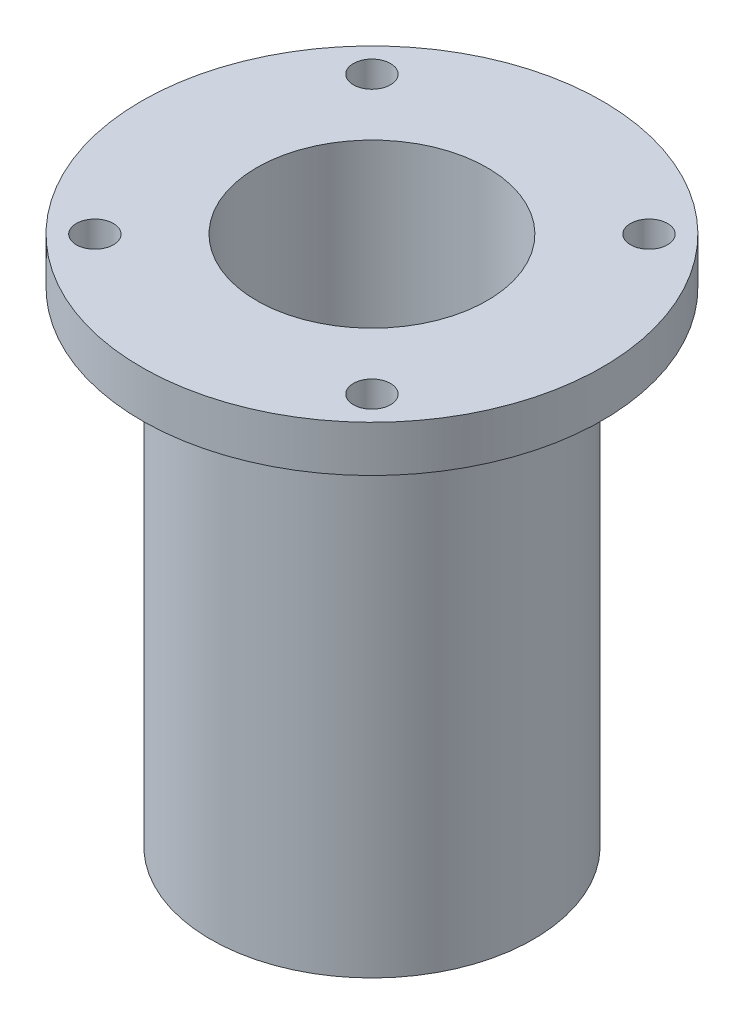
ISO-10303-21;
HEADER;
FILE_DESCRIPTION(('STEP AP214'),'2;1');
FILE_NAME('part.step','',(''),(''),'','','');
FILE_SCHEMA(('AUTOMOTIVE_DESIGN { 1 0 10303 214 1 1 1 1 }'));
ENDSEC;
DATA;
#1=APPLICATION_CONTEXT('core data for automotive mechanical design processes');
#2=APPLICATION_PROTOCOL_DEFINITION('international standard','automotive_design',2000,#1);
#3=PRODUCT_CONTEXT('',#1,'mechanical');
#4=PRODUCT('Part','Part','',(#3));
#5=PRODUCT_RELATED_PRODUCT_CATEGORY('part','',(#4));
#6=PRODUCT_DEFINITION_FORMATION('','',#4);
#7=PRODUCT_DEFINITION_CONTEXT('part definition',#1,'design');
#8=PRODUCT_DEFINITION('design','',#6,#7);
#9=PRODUCT_DEFINITION_SHAPE('','',#8);
#10=(LENGTH_UNIT() NAMED_UNIT(*) SI_UNIT(.MILLI.,.METRE.));
#11=(NAMED_UNIT(*) PLANE_ANGLE_UNIT() SI_UNIT($,.RADIAN.));
#12=(NAMED_UNIT(*) SI_UNIT($,.STERADIAN.) SOLID_ANGLE_UNIT());
#13=UNCERTAINTY_MEASURE_WITH_UNIT(LENGTH_MEASURE(1.E-05),#10,'distance_accuracy_value','');
#14=(GEOMETRIC_REPRESENTATION_CONTEXT(3) GLOBAL_UNCERTAINTY_ASSIGNED_CONTEXT((#13)) GLOBAL_UNIT_ASSIGNED_CONTEXT((#10,
#11,#12)) REPRESENTATION_CONTEXT('',''));
#15=CARTESIAN_POINT('',(0.,0.,0.));
#16=DIRECTION('',(0.,0.,1.));
#17=DIRECTION('',(1.,0.,0.));
#18=AXIS2_PLACEMENT_3D('',#15,#16,#17);
#19=CARTESIAN_POINT('',(0.,0.,0.));
#20=DIRECTION('',(0.,1.,0.));
#21=DIRECTION('',(-1.,0.,0.));
#22=AXIS2_PLACEMENT_3D('',#19,#20,#21);
#23=CYLINDRICAL_SURFACE('',#22,31.75);
#24=CARTESIAN_POINT('',(0.,-6.34999999999999,0.));
#25=DIRECTION('',(0.,1.,0.));
#26=DIRECTION('',(-1.,0.,0.));
#27=AXIS2_PLACEMENT_3D('',#24,#25,#26);
#28=CIRCLE('',#27,31.75);
#29=CARTESIAN_POINT('',(-31.75,-6.35,0.));
#30=VERTEX_POINT('',#29);
#31=EDGE_CURVE('E85',#30,#30,#28,.T.);
#32=ORIENTED_EDGE('',*,*,#31,.T.);
#33=EDGE_LOOP('',(#32));
#34=FACE_BOUND('',#33,.T.);
#35=CARTESIAN_POINT('',(0.,0.,0.));
#36=DIRECTION('',(0.,1.,0.));
#37=DIRECTION('',(-1.,0.,0.));
#38=AXIS2_PLACEMENT_3D('',#35,#36,#37);
#39=CIRCLE('',#38,31.75);
#40=CARTESIAN_POINT('',(-31.75,0.,0.));
#41=VERTEX_POINT('',#40);
#42=EDGE_CURVE('E10',#41,#41,#39,.T.);
#43=ORIENTED_EDGE('',*,*,#42,.F.);
#44=EDGE_LOOP('',(#43));
#45=FACE_BOUND('',#44,.T.);
#46=ADVANCED_FACE('F39',(#34,#45),#23,.T.);
#47=CARTESIAN_POINT('',(-31.75,0.,0.));
#48=DIRECTION('',(0.,1.,0.));
#49=DIRECTION('',(-1.,0.,0.));
#50=AXIS2_PLACEMENT_3D('',#47,#48,#49);
#51=PLANE('',#50);
#52=CARTESIAN_POINT('',(19.0830442572721,0.,19.0830442572718));
#53=DIRECTION('',(0.,1.,0.));
#54=DIRECTION('',(0.,0.,1.));
#55=AXIS2_PLACEMENT_3D('',#52,#53,#54);
#56=CIRCLE('',#55,2.5527);
#57=CARTESIAN_POINT('',(19.0830442572721,0.,21.6357442572718));
#58=VERTEX_POINT('',#57);
#59=EDGE_CURVE('E71',#58,#58,#56,.T.);
#60=ORIENTED_EDGE('',*,*,#59,.F.);
#61=EDGE_LOOP('',(#60));
#62=FACE_BOUND('',#61,.T.);
#63=CARTESIAN_POINT('',(-19.083044257272,0.,19.0830442572719));
#64=DIRECTION('',(0.,1.,0.));
#65=DIRECTION('',(0.,0.,1.));
#66=AXIS2_PLACEMENT_3D('',#63,#64,#65);
#67=CIRCLE('',#66,2.5527);
#68=CARTESIAN_POINT('',(-19.083044257272,0.,21.6357442572719));
#69=VERTEX_POINT('',#68);
#70=EDGE_CURVE('E61',#69,#69,#67,.T.);
#71=ORIENTED_EDGE('',*,*,#70,.F.);
#72=EDGE_LOOP('',(#71));
#73=FACE_BOUND('',#72,.T.);
#74=CARTESIAN_POINT('',(-19.0830442572719,0.,-19.083044257272));
#75=DIRECTION('',(0.,1.,0.));
#76=DIRECTION('',(0.,0.,1.));
#77=AXIS2_PLACEMENT_3D('',#74,#75,#76);
#78=CIRCLE('',#77,2.5527);
#79=CARTESIAN_POINT('',(-19.0830442572719,0.,-16.530344257272));
#80=VERTEX_POINT('',#79);
#81=EDGE_CURVE('E58',#80,#80,#78,.T.);
#82=ORIENTED_EDGE('',*,*,#81,.F.);
#83=EDGE_LOOP('',(#82));
#84=FACE_BOUND('',#83,.T.);
#85=CARTESIAN_POINT('',(19.083044257272,0.,-19.0830442572719));
#86=DIRECTION('',(0.,1.,0.));
#87=DIRECTION('',(0.,0.,1.));
#88=AXIS2_PLACEMENT_3D('',#85,#86,#87);
#89=CIRCLE('',#88,2.5527);
#90=CARTESIAN_POINT('',(19.083044257272,0.,-16.5303442572719));
#91=VERTEX_POINT('',#90);
#92=EDGE_CURVE('E57',#91,#91,#89,.T.);
#93=ORIENTED_EDGE('',*,*,#92,.F.);
#94=EDGE_LOOP('',(#93));
#95=FACE_BOUND('',#94,.T.);
#96=ORIENTED_EDGE('',*,*,#42,.T.);
#97=EDGE_LOOP('',(#96));
#98=FACE_BOUND('',#97,.T.);
#99=CARTESIAN_POINT('',(0.,0.,0.));
#100=DIRECTION('',(0.,1.,0.));
#101=DIRECTION('',(-1.,0.,0.));
#102=AXIS2_PLACEMENT_3D('',#99,#100,#101);
#103=CIRCLE('',#102,15.875);
#104=CARTESIAN_POINT('',(-15.875,0.,0.));
#105=VERTEX_POINT('',#104);
#106=EDGE_CURVE('E46',#105,#105,#103,.T.);
#107=ORIENTED_EDGE('',*,*,#106,.F.);
#108=EDGE_LOOP('',(#107));
#109=FACE_BOUND('',#108,.T.);
#110=ADVANCED_FACE('F100',(#62,#73,#84,#95,#98,#109),#51,.T.);
#111=CARTESIAN_POINT('',(0.,0.,0.));
#112=DIRECTION('',(0.,1.,0.));
#113=DIRECTION('',(-1.,0.,0.));
#114=AXIS2_PLACEMENT_3D('',#111,#112,#113);
#115=CYLINDRICAL_SURFACE('',#114,15.875);
#116=ORIENTED_EDGE('',*,*,#106,.T.);
#117=EDGE_LOOP('',(#116));
#118=FACE_BOUND('',#117,.T.);
#119=CARTESIAN_POINT('',(0.,-63.5,0.));
#120=DIRECTION('',(0.,1.,0.));
#121=DIRECTION('',(-1.,0.,0.));
#122=AXIS2_PLACEMENT_3D('',#119,#120,#121);
#123=CIRCLE('',#122,15.875);
#124=CARTESIAN_POINT('',(-15.875,-63.5,0.));
#125=VERTEX_POINT('',#124);
#126=EDGE_CURVE('E51',#125,#125,#123,.T.);
#127=ORIENTED_EDGE('',*,*,#126,.F.);
#128=EDGE_LOOP('',(#127));
#129=FACE_BOUND('',#128,.T.);
#130=ADVANCED_FACE('F98',(#118,#129),#115,.F.);
#131=CARTESIAN_POINT('',(-15.875,-63.5,0.));
#132=DIRECTION('',(0.,1.,0.));
#133=DIRECTION('',(-1.,0.,0.));
#134=AXIS2_PLACEMENT_3D('',#131,#132,#133);
#135=PLANE('',#134);
#136=CARTESIAN_POINT('',(0.,-63.5,0.));
#137=DIRECTION('',(0.,1.,0.));
#138=DIRECTION('',(-1.,0.,0.));
#139=AXIS2_PLACEMENT_3D('',#136,#137,#138);
#140=CIRCLE('',#139,7.13739999999999);
#141=CARTESIAN_POINT('',(-7.13739999999998,-63.5,0.));
#142=VERTEX_POINT('',#141);
#143=EDGE_CURVE('E82',#142,#142,#140,.T.);
#144=ORIENTED_EDGE('',*,*,#143,.F.);
#145=EDGE_LOOP('',(#144));
#146=FACE_BOUND('',#145,.T.);
#147=ORIENTED_EDGE('',*,*,#126,.T.);
#148=EDGE_LOOP('',(#147));
#149=FACE_BOUND('',#148,.T.);
#150=ADVANCED_FACE('F96',(#146,#149),#135,.T.);
#151=CARTESIAN_POINT('',(0.,-73.025,0.));
#152=DIRECTION('',(0.,-1.,0.));
#153=DIRECTION('',(1.,0.,0.));
#154=AXIS2_PLACEMENT_3D('',#151,#152,#153);
#155=PLANE('',#154);
#156=CARTESIAN_POINT('',(0.,-73.025,0.));
#157=DIRECTION('',(0.,-1.,0.));
#158=DIRECTION('',(0.,0.,-1.));
#159=AXIS2_PLACEMENT_3D('',#156,#157,#158);
#160=CIRCLE('',#159,7.13739999999999);
#161=CARTESIAN_POINT('',(0.,-73.025,-7.13739999999999));
#162=VERTEX_POINT('',#161);
#163=EDGE_CURVE('E79',#162,#162,#160,.T.);
#164=ORIENTED_EDGE('',*,*,#163,.F.);
#165=EDGE_LOOP('',(#164));
#166=FACE_BOUND('',#165,.T.);
#167=CARTESIAN_POINT('',(0.,-73.025,0.));
#168=DIRECTION('',(0.,1.,0.));
#169=DIRECTION('',(-1.,0.,0.));
#170=AXIS2_PLACEMENT_3D('',#167,#168,#169);
#171=CIRCLE('',#170,22.225);
#172=CARTESIAN_POINT('',(-22.225,-73.025,0.));
#173=VERTEX_POINT('',#172);
#174=EDGE_CURVE('E91',#173,#173,#171,.T.);
#175=ORIENTED_EDGE('',*,*,#174,.F.);
#176=EDGE_LOOP('',(#175));
#177=FACE_BOUND('',#176,.T.);
#178=ADVANCED_FACE('F108',(#166,#177),#155,.T.);
#179=CARTESIAN_POINT('',(0.,0.,0.));
#180=DIRECTION('',(0.,1.,0.));
#181=DIRECTION('',(-1.,0.,0.));
#182=AXIS2_PLACEMENT_3D('',#179,#180,#181);
#183=CYLINDRICAL_SURFACE('',#182,22.225);
#184=ORIENTED_EDGE('',*,*,#174,.T.);
#185=EDGE_LOOP('',(#184));
#186=FACE_BOUND('',#185,.T.);
#187=CARTESIAN_POINT('',(0.,-6.34999999999999,0.));
#188=DIRECTION('',(0.,1.,0.));
#189=DIRECTION('',(-1.,0.,0.));
#190=AXIS2_PLACEMENT_3D('',#187,#188,#189);
#191=CIRCLE('',#190,22.225);
#192=CARTESIAN_POINT('',(-22.225,-6.34999999999999,0.));
#193=VERTEX_POINT('',#192);
#194=EDGE_CURVE('E88',#193,#193,#191,.T.);
#195=ORIENTED_EDGE('',*,*,#194,.F.);
#196=EDGE_LOOP('',(#195));
#197=FACE_BOUND('',#196,.T.);
#198=ADVANCED_FACE('F122',(#186,#197),#183,.T.);
#199=CARTESIAN_POINT('',(-22.225,-6.34999999999999,0.));
#200=DIRECTION('',(0.,-1.,0.));
#201=DIRECTION('',(1.,0.,0.));
#202=AXIS2_PLACEMENT_3D('',#199,#200,#201);
#203=PLANE('',#202);
#204=CARTESIAN_POINT('',(19.0830442572721,-6.34999999999999,19.0830442572718));
#205=DIRECTION('',(0.,-1.,0.));
#206=DIRECTION('',(1.,0.,0.));
#207=AXIS2_PLACEMENT_3D('',#204,#205,#206);
#208=CIRCLE('',#207,2.5527);
#209=CARTESIAN_POINT('',(21.6357442572721,-6.34999999999999,19.0830442572718));
#210=VERTEX_POINT('',#209);
#211=EDGE_CURVE('E42',#210,#210,#208,.T.);
#212=ORIENTED_EDGE('',*,*,#211,.F.);
#213=EDGE_LOOP('',(#212));
#214=FACE_BOUND('',#213,.T.);
#215=CARTESIAN_POINT('',(-19.083044257272,-6.34999999999999,19.0830442572719));
#216=DIRECTION('',(0.,-1.,0.));
#217=DIRECTION('',(1.,0.,0.));
#218=AXIS2_PLACEMENT_3D('',#215,#216,#217);
#219=CIRCLE('',#218,2.5527);
#220=CARTESIAN_POINT('',(-16.5303442572721,-6.34999999999999,19.0830442572719));
#221=VERTEX_POINT('',#220);
#222=EDGE_CURVE('E59',#221,#221,#219,.T.);
#223=ORIENTED_EDGE('',*,*,#222,.F.);
#224=EDGE_LOOP('',(#223));
#225=FACE_BOUND('',#224,.T.);
#226=CARTESIAN_POINT('',(-19.0830442572719,-6.34999999999999,-19.083044257272));
#227=DIRECTION('',(0.,-1.,0.));
#228=DIRECTION('',(1.,0.,0.));
#229=AXIS2_PLACEMENT_3D('',#226,#227,#228);
#230=CIRCLE('',#229,2.5527);
#231=CARTESIAN_POINT('',(-16.5303442572719,-6.34999999999999,-19.083044257272));
#232=VERTEX_POINT('',#231);
#233=EDGE_CURVE('E55',#232,#232,#230,.T.);
#234=ORIENTED_EDGE('',*,*,#233,.F.);
#235=EDGE_LOOP('',(#234));
#236=FACE_BOUND('',#235,.T.);
#237=CARTESIAN_POINT('',(19.083044257272,-6.34999999999999,-19.0830442572719));
#238=DIRECTION('',(0.,-1.,0.));
#239=DIRECTION('',(1.,0.,0.));
#240=AXIS2_PLACEMENT_3D('',#237,#238,#239);
#241=CIRCLE('',#240,2.5527);
#242=CARTESIAN_POINT('',(21.635744257272,-6.34999999999999,-19.0830442572719));
#243=VERTEX_POINT('',#242);
#244=EDGE_CURVE('E76',#243,#243,#241,.T.);
#245=ORIENTED_EDGE('',*,*,#244,.F.);
#246=EDGE_LOOP('',(#245));
#247=FACE_BOUND('',#246,.T.);
#248=ORIENTED_EDGE('',*,*,#194,.T.);
#249=EDGE_LOOP('',(#248));
#250=FACE_BOUND('',#249,.T.);
#251=ORIENTED_EDGE('',*,*,#31,.F.);
#252=EDGE_LOOP('',(#251));
#253=FACE_BOUND('',#252,.T.);
#254=ADVANCED_FACE('F119',(#214,#225,#236,#247,#250,#253),#203,.T.);
#255=CARTESIAN_POINT('',(0.,-73.025,0.));
#256=DIRECTION('',(0.,-1.,0.));
#257=DIRECTION('',(0.,0.,-1.));
#258=AXIS2_PLACEMENT_3D('',#255,#256,#257);
#259=CYLINDRICAL_SURFACE('',#258,7.13739999999999);
#260=ORIENTED_EDGE('',*,*,#143,.T.);
#261=EDGE_LOOP('',(#260));
#262=FACE_BOUND('',#261,.T.);
#263=ORIENTED_EDGE('',*,*,#163,.T.);
#264=EDGE_LOOP('',(#263));
#265=FACE_BOUND('',#264,.T.);
#266=ADVANCED_FACE('F121',(#262,#265),#259,.F.);
#267=CARTESIAN_POINT('',(19.083044257272,0.,-19.0830442572719));
#268=DIRECTION('',(0.,1.,0.));
#269=DIRECTION('',(0.,0.,1.));
#270=AXIS2_PLACEMENT_3D('',#267,#268,#269);
#271=CYLINDRICAL_SURFACE('',#270,2.5527);
#272=ORIENTED_EDGE('',*,*,#244,.T.);
#273=EDGE_LOOP('',(#272));
#274=FACE_BOUND('',#273,.T.);
#275=ORIENTED_EDGE('',*,*,#92,.T.);
#276=EDGE_LOOP('',(#275));
#277=FACE_BOUND('',#276,.T.);
#278=ADVANCED_FACE('F129',(#274,#277),#271,.F.);
#279=CARTESIAN_POINT('',(-19.0830442572719,0.,-19.083044257272));
#280=DIRECTION('',(0.,1.,0.));
#281=DIRECTION('',(0.,0.,1.));
#282=AXIS2_PLACEMENT_3D('',#279,#280,#281);
#283=CYLINDRICAL_SURFACE('',#282,2.5527);
#284=ORIENTED_EDGE('',*,*,#233,.T.);
#285=EDGE_LOOP('',(#284));
#286=FACE_BOUND('',#285,.T.);
#287=ORIENTED_EDGE('',*,*,#81,.T.);
#288=EDGE_LOOP('',(#287));
#289=FACE_BOUND('',#288,.T.);
#290=ADVANCED_FACE('F163',(#286,#289),#283,.F.);
#291=CARTESIAN_POINT('',(-19.083044257272,0.,19.0830442572719));
#292=DIRECTION('',(0.,1.,0.));
#293=DIRECTION('',(0.,0.,1.));
#294=AXIS2_PLACEMENT_3D('',#291,#292,#293);
#295=CYLINDRICAL_SURFACE('',#294,2.5527);
#296=ORIENTED_EDGE('',*,*,#222,.T.);
#297=EDGE_LOOP('',(#296));
#298=FACE_BOUND('',#297,.T.);
#299=ORIENTED_EDGE('',*,*,#70,.T.);
#300=EDGE_LOOP('',(#299));
#301=FACE_BOUND('',#300,.T.);
#302=ADVANCED_FACE('F200',(#298,#301),#295,.F.);
#303=CARTESIAN_POINT('',(19.0830442572721,0.,19.0830442572718));
#304=DIRECTION('',(0.,1.,0.));
#305=DIRECTION('',(0.,0.,1.));
#306=AXIS2_PLACEMENT_3D('',#303,#304,#305);
#307=CYLINDRICAL_SURFACE('',#306,2.5527);
#308=ORIENTED_EDGE('',*,*,#211,.T.);
#309=EDGE_LOOP('',(#308));
#310=FACE_BOUND('',#309,.T.);
#311=ORIENTED_EDGE('',*,*,#59,.T.);
#312=EDGE_LOOP('',(#311));
#313=FACE_BOUND('',#312,.T.);
#314=ADVANCED_FACE('F209',(#310,#313),#307,.F.);
#315=CLOSED_SHELL('',(#46,#110,#130,#150,#178,#198,#254,#266,#278,#290,#302,#314));
#316=MANIFOLD_SOLID_BREP('B2',#315);
#317=ADVANCED_BREP_SHAPE_REPRESENTATION('',(#18,#316),#14);
#318=SHAPE_DEFINITION_REPRESENTATION(#9,#317);
ENDSEC;
END-ISO-10303-21;
